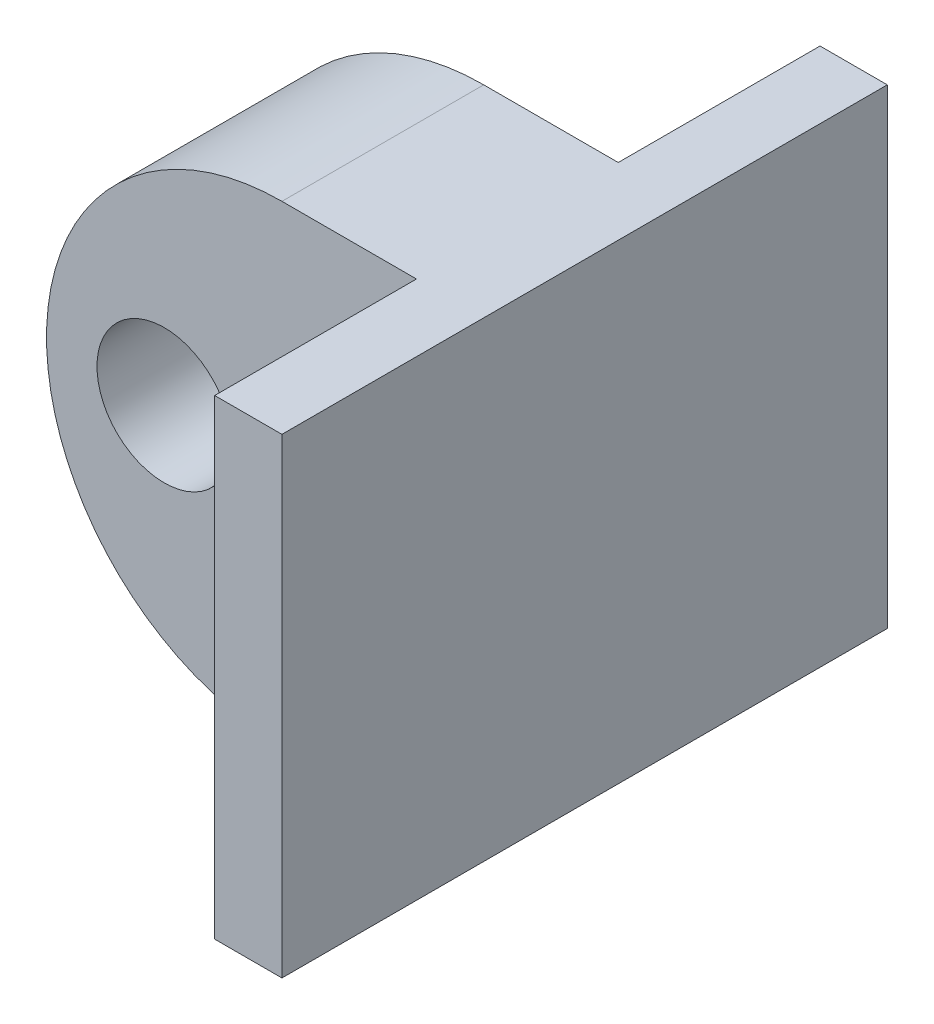
ISO-10303-21;
HEADER;
FILE_DESCRIPTION(('STEP AP214'),'2;1');
FILE_NAME('part.step','',(''),(''),'','','');
FILE_SCHEMA(('AUTOMOTIVE_DESIGN { 1 0 10303 214 1 1 1 1 }'));
ENDSEC;
DATA;
#1=APPLICATION_CONTEXT('core data for automotive mechanical design processes');
#2=APPLICATION_PROTOCOL_DEFINITION('international standard','automotive_design',2000,#1);
#3=PRODUCT_CONTEXT('',#1,'mechanical');
#4=PRODUCT('Part','Part','',(#3));
#5=PRODUCT_RELATED_PRODUCT_CATEGORY('part','',(#4));
#6=PRODUCT_DEFINITION_FORMATION('','',#4);
#7=PRODUCT_DEFINITION_CONTEXT('part definition',#1,'design');
#8=PRODUCT_DEFINITION('design','',#6,#7);
#9=PRODUCT_DEFINITION_SHAPE('','',#8);
#10=(LENGTH_UNIT() NAMED_UNIT(*) SI_UNIT(.MILLI.,.METRE.));
#11=(NAMED_UNIT(*) PLANE_ANGLE_UNIT() SI_UNIT($,.RADIAN.));
#12=(NAMED_UNIT(*) SI_UNIT($,.STERADIAN.) SOLID_ANGLE_UNIT());
#13=UNCERTAINTY_MEASURE_WITH_UNIT(LENGTH_MEASURE(1.E-05),#10,'distance_accuracy_value','');
#14=(GEOMETRIC_REPRESENTATION_CONTEXT(3) GLOBAL_UNCERTAINTY_ASSIGNED_CONTEXT((#13)) GLOBAL_UNIT_ASSIGNED_CONTEXT((#10,
#11,#12)) REPRESENTATION_CONTEXT('',''));
#15=CARTESIAN_POINT('',(0.,0.,0.));
#16=DIRECTION('',(0.,0.,1.));
#17=DIRECTION('',(1.,0.,0.));
#18=AXIS2_PLACEMENT_3D('',#15,#16,#17);
#19=CARTESIAN_POINT('',(0.,0.,30.));
#20=DIRECTION('',(0.,0.,1.));
#21=DIRECTION('',(1.,0.,0.));
#22=AXIS2_PLACEMENT_3D('',#19,#20,#21);
#23=PLANE('',#22);
#24=CARTESIAN_POINT('',(0.,0.,30.));
#25=DIRECTION('',(0.,0.,1.));
#26=DIRECTION('',(1.,0.,0.));
#27=AXIS2_PLACEMENT_3D('',#24,#25,#26);
#28=CIRCLE('',#27,35.);
#29=CARTESIAN_POINT('',(0.,35.,30.));
#30=VERTEX_POINT('',#29);
#31=CARTESIAN_POINT('',(0.,-35.,30.));
#32=VERTEX_POINT('',#31);
#33=EDGE_CURVE('E96',#30,#32,#28,.T.);
#34=ORIENTED_EDGE('',*,*,#33,.T.);
#35=DIRECTION('',(1.,0.,0.));
#36=VECTOR('',#35,1.);
#37=CARTESIAN_POINT('',(0.,-35.,30.));
#38=LINE('',#37,#36);
#39=CARTESIAN_POINT('',(20.,-35.,30.));
#40=VERTEX_POINT('',#39);
#41=EDGE_CURVE('E87',#32,#40,#38,.T.);
#42=ORIENTED_EDGE('',*,*,#41,.T.);
#43=DIRECTION('',(0.,1.,0.));
#44=VECTOR('',#43,1.);
#45=CARTESIAN_POINT('',(20.,35.,30.));
#46=LINE('',#45,#44);
#47=CARTESIAN_POINT('',(20.,35.,30.));
#48=VERTEX_POINT('',#47);
#49=EDGE_CURVE('E95',#40,#48,#46,.T.);
#50=ORIENTED_EDGE('',*,*,#49,.T.);
#51=DIRECTION('',(-1.,0.,0.));
#52=VECTOR('',#51,1.);
#53=CARTESIAN_POINT('',(0.,35.,30.));
#54=LINE('',#53,#52);
#55=EDGE_CURVE('E57',#48,#30,#54,.T.);
#56=ORIENTED_EDGE('',*,*,#55,.T.);
#57=EDGE_LOOP('',(#34,#42,#50,#56));
#58=FACE_BOUND('',#57,.T.);
#59=CARTESIAN_POINT('',(-17.5,0.,30.));
#60=DIRECTION('',(0.,0.,1.));
#61=DIRECTION('',(1.,0.,0.));
#62=AXIS2_PLACEMENT_3D('',#59,#60,#61);
#63=CIRCLE('',#62,10.);
#64=CARTESIAN_POINT('',(-7.5,0.,30.));
#65=VERTEX_POINT('',#64);
#66=EDGE_CURVE('E108',#65,#65,#63,.T.);
#67=ORIENTED_EDGE('',*,*,#66,.F.);
#68=EDGE_LOOP('',(#67));
#69=FACE_BOUND('',#68,.T.);
#70=ADVANCED_FACE('F39',(#58,#69),#23,.T.);
#71=CARTESIAN_POINT('',(0.,0.,0.));
#72=DIRECTION('',(0.,0.,1.));
#73=DIRECTION('',(1.,0.,0.));
#74=AXIS2_PLACEMENT_3D('',#71,#72,#73);
#75=PLANE('',#74);
#76=CARTESIAN_POINT('',(0.,0.,0.));
#77=DIRECTION('',(0.,0.,1.));
#78=DIRECTION('',(1.,0.,0.));
#79=AXIS2_PLACEMENT_3D('',#76,#77,#78);
#80=CIRCLE('',#79,35.);
#81=CARTESIAN_POINT('',(0.,35.,0.));
#82=VERTEX_POINT('',#81);
#83=CARTESIAN_POINT('',(0.,-35.,0.));
#84=VERTEX_POINT('',#83);
#85=EDGE_CURVE('E105',#82,#84,#80,.T.);
#86=ORIENTED_EDGE('',*,*,#85,.F.);
#87=DIRECTION('',(-1.,0.,0.));
#88=VECTOR('',#87,1.);
#89=CARTESIAN_POINT('',(0.,35.,0.));
#90=LINE('',#89,#88);
#91=CARTESIAN_POINT('',(20.,35.,0.));
#92=VERTEX_POINT('',#91);
#93=EDGE_CURVE('E103',#92,#82,#90,.T.);
#94=ORIENTED_EDGE('',*,*,#93,.F.);
#95=DIRECTION('',(0.,1.,0.));
#96=VECTOR('',#95,1.);
#97=CARTESIAN_POINT('',(20.,35.,0.));
#98=LINE('',#97,#96);
#99=CARTESIAN_POINT('',(20.,-35.,0.));
#100=VERTEX_POINT('',#99);
#101=EDGE_CURVE('E78',#100,#92,#98,.T.);
#102=ORIENTED_EDGE('',*,*,#101,.F.);
#103=DIRECTION('',(1.,0.,0.));
#104=VECTOR('',#103,1.);
#105=CARTESIAN_POINT('',(0.,-35.,0.));
#106=LINE('',#105,#104);
#107=EDGE_CURVE('E70',#84,#100,#106,.T.);
#108=ORIENTED_EDGE('',*,*,#107,.F.);
#109=EDGE_LOOP('',(#86,#94,#102,#108));
#110=FACE_BOUND('',#109,.T.);
#111=CARTESIAN_POINT('',(-17.5,0.,0.));
#112=DIRECTION('',(0.,0.,1.));
#113=DIRECTION('',(1.,0.,0.));
#114=AXIS2_PLACEMENT_3D('',#111,#112,#113);
#115=CIRCLE('',#114,10.);
#116=CARTESIAN_POINT('',(-7.5,0.,0.));
#117=VERTEX_POINT('',#116);
#118=EDGE_CURVE('E114',#117,#117,#115,.T.);
#119=ORIENTED_EDGE('',*,*,#118,.T.);
#120=EDGE_LOOP('',(#119));
#121=FACE_BOUND('',#120,.T.);
#122=ADVANCED_FACE('F214',(#110,#121),#75,.F.);
#123=CARTESIAN_POINT('',(0.,0.,30.));
#124=DIRECTION('',(0.,0.,-1.));
#125=DIRECTION('',(-1.,0.,0.));
#126=AXIS2_PLACEMENT_3D('',#123,#124,#125);
#127=CYLINDRICAL_SURFACE('',#126,35.);
#128=ORIENTED_EDGE('',*,*,#85,.T.);
#129=DIRECTION('',(0.,0.,-1.));
#130=VECTOR('',#129,1.);
#131=CARTESIAN_POINT('',(0.,-35.,30.));
#132=LINE('',#131,#130);
#133=EDGE_CURVE('E11',#32,#84,#132,.T.);
#134=ORIENTED_EDGE('',*,*,#133,.F.);
#135=ORIENTED_EDGE('',*,*,#33,.F.);
#136=DIRECTION('',(0.,0.,-1.));
#137=VECTOR('',#136,1.);
#138=CARTESIAN_POINT('',(0.,35.,30.));
#139=LINE('',#138,#137);
#140=EDGE_CURVE('E49',#30,#82,#139,.T.);
#141=ORIENTED_EDGE('',*,*,#140,.T.);
#142=EDGE_LOOP('',(#128,#134,#135,#141));
#143=FACE_BOUND('',#142,.T.);
#144=ADVANCED_FACE('F41',(#143),#127,.T.);
#145=CARTESIAN_POINT('',(0.,-35.,30.));
#146=DIRECTION('',(0.,1.,0.));
#147=DIRECTION('',(0.,0.,1.));
#148=AXIS2_PLACEMENT_3D('',#145,#146,#147);
#149=PLANE('',#148);
#150=ORIENTED_EDGE('',*,*,#107,.T.);
#151=DIRECTION('',(0.,0.,-1.));
#152=VECTOR('',#151,1.);
#153=CARTESIAN_POINT('',(20.,-35.,-30.));
#154=LINE('',#153,#152);
#155=CARTESIAN_POINT('',(20.,-35.,-30.));
#156=VERTEX_POINT('',#155);
#157=EDGE_CURVE('E149',#100,#156,#154,.T.);
#158=ORIENTED_EDGE('',*,*,#157,.T.);
#159=DIRECTION('',(-1.,0.,0.));
#160=VECTOR('',#159,1.);
#161=CARTESIAN_POINT('',(30.,-35.,-30.));
#162=LINE('',#161,#160);
#163=CARTESIAN_POINT('',(30.,-35.,-30.));
#164=VERTEX_POINT('',#163);
#165=EDGE_CURVE('E141',#164,#156,#162,.T.);
#166=ORIENTED_EDGE('',*,*,#165,.F.);
#167=DIRECTION('',(0.,0.,-1.));
#168=VECTOR('',#167,1.);
#169=CARTESIAN_POINT('',(30.,-35.,-30.));
#170=LINE('',#169,#168);
#171=CARTESIAN_POINT('',(30.,-35.,60.));
#172=VERTEX_POINT('',#171);
#173=EDGE_CURVE('E145',#172,#164,#170,.T.);
#174=ORIENTED_EDGE('',*,*,#173,.F.);
#175=DIRECTION('',(-1.,0.,0.));
#176=VECTOR('',#175,1.);
#177=CARTESIAN_POINT('',(30.,-35.,60.));
#178=LINE('',#177,#176);
#179=CARTESIAN_POINT('',(20.,-35.,60.));
#180=VERTEX_POINT('',#179);
#181=EDGE_CURVE('E138',#172,#180,#178,.T.);
#182=ORIENTED_EDGE('',*,*,#181,.T.);
#183=EDGE_CURVE('E93',#180,#40,#154,.T.);
#184=ORIENTED_EDGE('',*,*,#183,.T.);
#185=ORIENTED_EDGE('',*,*,#41,.F.);
#186=ORIENTED_EDGE('',*,*,#133,.T.);
#187=EDGE_LOOP('',(#150,#158,#166,#174,#182,#184,#185,#186));
#188=FACE_BOUND('',#187,.T.);
#189=ADVANCED_FACE('F88',(#188),#149,.F.);
#190=CARTESIAN_POINT('',(0.,35.,30.));
#191=DIRECTION('',(0.,-1.,0.));
#192=DIRECTION('',(0.,0.,-1.));
#193=AXIS2_PLACEMENT_3D('',#190,#191,#192);
#194=PLANE('',#193);
#195=ORIENTED_EDGE('',*,*,#93,.T.);
#196=ORIENTED_EDGE('',*,*,#140,.F.);
#197=ORIENTED_EDGE('',*,*,#55,.F.);
#198=DIRECTION('',(0.,0.,1.));
#199=VECTOR('',#198,1.);
#200=CARTESIAN_POINT('',(20.,35.,-30.));
#201=LINE('',#200,#199);
#202=CARTESIAN_POINT('',(20.,35.,60.));
#203=VERTEX_POINT('',#202);
#204=EDGE_CURVE('E157',#48,#203,#201,.T.);
#205=ORIENTED_EDGE('',*,*,#204,.T.);
#206=DIRECTION('',(-1.,0.,0.));
#207=VECTOR('',#206,1.);
#208=CARTESIAN_POINT('',(30.,35.,60.));
#209=LINE('',#208,#207);
#210=CARTESIAN_POINT('',(30.,35.,60.));
#211=VERTEX_POINT('',#210);
#212=EDGE_CURVE('E134',#211,#203,#209,.T.);
#213=ORIENTED_EDGE('',*,*,#212,.F.);
#214=DIRECTION('',(0.,0.,1.));
#215=VECTOR('',#214,1.);
#216=CARTESIAN_POINT('',(30.,35.,-30.));
#217=LINE('',#216,#215);
#218=CARTESIAN_POINT('',(30.,35.,-30.));
#219=VERTEX_POINT('',#218);
#220=EDGE_CURVE('E169',#219,#211,#217,.T.);
#221=ORIENTED_EDGE('',*,*,#220,.F.);
#222=DIRECTION('',(-1.,0.,0.));
#223=VECTOR('',#222,1.);
#224=CARTESIAN_POINT('',(30.,35.,-30.));
#225=LINE('',#224,#223);
#226=CARTESIAN_POINT('',(20.,35.,-30.));
#227=VERTEX_POINT('',#226);
#228=EDGE_CURVE('E129',#219,#227,#225,.T.);
#229=ORIENTED_EDGE('',*,*,#228,.T.);
#230=EDGE_CURVE('E154',#227,#92,#201,.T.);
#231=ORIENTED_EDGE('',*,*,#230,.T.);
#232=EDGE_LOOP('',(#195,#196,#197,#205,#213,#221,#229,#231));
#233=FACE_BOUND('',#232,.T.);
#234=ADVANCED_FACE('F193',(#233),#194,.F.);
#235=CARTESIAN_POINT('',(-17.5,0.,30.));
#236=DIRECTION('',(0.,0.,-1.));
#237=DIRECTION('',(-1.,0.,0.));
#238=AXIS2_PLACEMENT_3D('',#235,#236,#237);
#239=CYLINDRICAL_SURFACE('',#238,10.);
#240=ORIENTED_EDGE('',*,*,#66,.T.);
#241=EDGE_LOOP('',(#240));
#242=FACE_BOUND('',#241,.T.);
#243=ORIENTED_EDGE('',*,*,#118,.F.);
#244=EDGE_LOOP('',(#243));
#245=FACE_BOUND('',#244,.T.);
#246=ADVANCED_FACE('F219',(#242,#245),#239,.F.);
#247=CARTESIAN_POINT('',(20.,0.,0.));
#248=DIRECTION('',(-1.,0.,0.));
#249=DIRECTION('',(0.,0.,1.));
#250=AXIS2_PLACEMENT_3D('',#247,#248,#249);
#251=PLANE('',#250);
#252=ORIENTED_EDGE('',*,*,#49,.F.);
#253=ORIENTED_EDGE('',*,*,#183,.F.);
#254=DIRECTION('',(0.,-1.,0.));
#255=VECTOR('',#254,1.);
#256=CARTESIAN_POINT('',(20.,35.,60.));
#257=LINE('',#256,#255);
#258=EDGE_CURVE('E150',#203,#180,#257,.T.);
#259=ORIENTED_EDGE('',*,*,#258,.F.);
#260=ORIENTED_EDGE('',*,*,#204,.F.);
#261=EDGE_LOOP('',(#252,#253,#259,#260));
#262=FACE_BOUND('',#261,.T.);
#263=ADVANCED_FACE('F217',(#262),#251,.T.);
#264=CARTESIAN_POINT('',(30.,35.,-30.));
#265=DIRECTION('',(0.,0.,1.));
#266=DIRECTION('',(1.,0.,0.));
#267=AXIS2_PLACEMENT_3D('',#264,#265,#266);
#268=PLANE('',#267);
#269=DIRECTION('',(0.,1.,0.));
#270=VECTOR('',#269,1.);
#271=CARTESIAN_POINT('',(20.,35.,-30.));
#272=LINE('',#271,#270);
#273=EDGE_CURVE('E158',#156,#227,#272,.T.);
#274=ORIENTED_EDGE('',*,*,#273,.T.);
#275=ORIENTED_EDGE('',*,*,#228,.F.);
#276=DIRECTION('',(0.,1.,0.));
#277=VECTOR('',#276,1.);
#278=CARTESIAN_POINT('',(30.,35.,-30.));
#279=LINE('',#278,#277);
#280=EDGE_CURVE('E148',#164,#219,#279,.T.);
#281=ORIENTED_EDGE('',*,*,#280,.F.);
#282=ORIENTED_EDGE('',*,*,#165,.T.);
#283=EDGE_LOOP('',(#274,#275,#281,#282));
#284=FACE_BOUND('',#283,.T.);
#285=ADVANCED_FACE('F189',(#284),#268,.F.);
#286=CARTESIAN_POINT('',(30.,35.,60.));
#287=DIRECTION('',(0.,0.,-1.));
#288=DIRECTION('',(0.,1.,0.));
#289=AXIS2_PLACEMENT_3D('',#286,#287,#288);
#290=PLANE('',#289);
#291=ORIENTED_EDGE('',*,*,#258,.T.);
#292=ORIENTED_EDGE('',*,*,#181,.F.);
#293=DIRECTION('',(0.,-1.,0.));
#294=VECTOR('',#293,1.);
#295=CARTESIAN_POINT('',(30.,35.,60.));
#296=LINE('',#295,#294);
#297=EDGE_CURVE('E165',#211,#172,#296,.T.);
#298=ORIENTED_EDGE('',*,*,#297,.F.);
#299=ORIENTED_EDGE('',*,*,#212,.T.);
#300=EDGE_LOOP('',(#291,#292,#298,#299));
#301=FACE_BOUND('',#300,.T.);
#302=ADVANCED_FACE('F210',(#301),#290,.F.);
#303=CARTESIAN_POINT('',(30.,0.,0.));
#304=DIRECTION('',(-1.,0.,0.));
#305=DIRECTION('',(0.,0.,1.));
#306=AXIS2_PLACEMENT_3D('',#303,#304,#305);
#307=PLANE('',#306);
#308=ORIENTED_EDGE('',*,*,#280,.T.);
#309=ORIENTED_EDGE('',*,*,#220,.T.);
#310=ORIENTED_EDGE('',*,*,#297,.T.);
#311=ORIENTED_EDGE('',*,*,#173,.T.);
#312=EDGE_LOOP('',(#308,#309,#310,#311));
#313=FACE_BOUND('',#312,.T.);
#314=ADVANCED_FACE('F179',(#313),#307,.F.);
#315=ORIENTED_EDGE('',*,*,#157,.F.);
#316=ORIENTED_EDGE('',*,*,#101,.T.);
#317=ORIENTED_EDGE('',*,*,#230,.F.);
#318=ORIENTED_EDGE('',*,*,#273,.F.);
#319=EDGE_LOOP('',(#315,#316,#317,#318));
#320=FACE_BOUND('',#319,.T.);
#321=ADVANCED_FACE('F212',(#320),#251,.T.);
#322=CLOSED_SHELL('',(#70,#122,#144,#189,#234,#246,#263,#285,#302,#314,#321));
#323=MANIFOLD_SOLID_BREP('B2',#322);
#324=ADVANCED_BREP_SHAPE_REPRESENTATION('',(#18,#323),#14);
#325=SHAPE_DEFINITION_REPRESENTATION(#9,#324);
ENDSEC;
END-ISO-10303-21;
